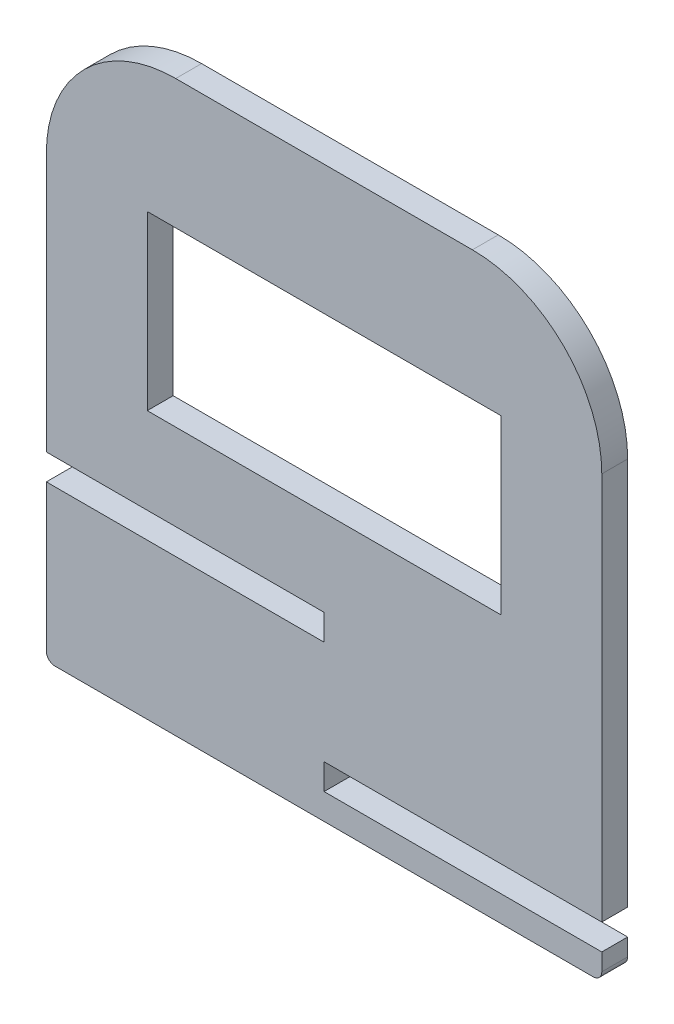
ISO-10303-21;
HEADER;
FILE_DESCRIPTION(('STEP AP214'),'2;1');
FILE_NAME('part.step','',(''),(''),'','','');
FILE_SCHEMA(('AUTOMOTIVE_DESIGN { 1 0 10303 214 1 1 1 1 }'));
ENDSEC;
DATA;
#1=APPLICATION_CONTEXT('core data for automotive mechanical design processes');
#2=APPLICATION_PROTOCOL_DEFINITION('international standard','automotive_design',2000,#1);
#3=PRODUCT_CONTEXT('',#1,'mechanical');
#4=PRODUCT('Part','Part','',(#3));
#5=PRODUCT_RELATED_PRODUCT_CATEGORY('part','',(#4));
#6=PRODUCT_DEFINITION_FORMATION('','',#4);
#7=PRODUCT_DEFINITION_CONTEXT('part definition',#1,'design');
#8=PRODUCT_DEFINITION('design','',#6,#7);
#9=PRODUCT_DEFINITION_SHAPE('','',#8);
#10=(LENGTH_UNIT() NAMED_UNIT(*) SI_UNIT(.MILLI.,.METRE.));
#11=(NAMED_UNIT(*) PLANE_ANGLE_UNIT() SI_UNIT($,.RADIAN.));
#12=(NAMED_UNIT(*) SI_UNIT($,.STERADIAN.) SOLID_ANGLE_UNIT());
#13=UNCERTAINTY_MEASURE_WITH_UNIT(LENGTH_MEASURE(1.E-05),#10,'distance_accuracy_value','');
#14=(GEOMETRIC_REPRESENTATION_CONTEXT(3) GLOBAL_UNCERTAINTY_ASSIGNED_CONTEXT((#13)) GLOBAL_UNIT_ASSIGNED_CONTEXT((#10,
#11,#12)) REPRESENTATION_CONTEXT('',''));
#15=CARTESIAN_POINT('',(0.,0.,0.));
#16=DIRECTION('',(0.,0.,1.));
#17=DIRECTION('',(1.,0.,0.));
#18=AXIS2_PLACEMENT_3D('',#15,#16,#17);
#19=CARTESIAN_POINT('',(-0.261503553829211,-69.4208677655693,3.));
#20=DIRECTION('',(0.,-1.,0.));
#21=DIRECTION('',(0.,0.,-1.));
#22=AXIS2_PLACEMENT_3D('',#19,#20,#21);
#23=PLANE('',#22);
#24=DIRECTION('',(-1.,0.,0.));
#25=VECTOR('',#24,1.);
#26=CARTESIAN_POINT('',(-0.261503553829211,-69.4208677655693,0.));
#27=LINE('',#26,#25);
#28=CARTESIAN_POINT('',(-0.261503553829211,-69.4208677655693,0.));
#29=VERTEX_POINT('',#28);
#30=CARTESIAN_POINT('',(-32.4615035538292,-69.4208677655693,0.));
#31=VERTEX_POINT('',#30);
#32=EDGE_CURVE('E251',#29,#31,#27,.T.);
#33=ORIENTED_EDGE('',*,*,#32,.T.);
#34=DIRECTION('',(0.,0.,-1.));
#35=VECTOR('',#34,1.);
#36=CARTESIAN_POINT('',(-32.4615035538292,-69.4208677655693,3.));
#37=LINE('',#36,#35);
#38=CARTESIAN_POINT('',(-32.4615035538292,-69.4208677655693,3.));
#39=VERTEX_POINT('',#38);
#40=EDGE_CURVE('E12',#39,#31,#37,.T.);
#41=ORIENTED_EDGE('',*,*,#40,.F.);
#42=DIRECTION('',(-1.,0.,0.));
#43=VECTOR('',#42,1.);
#44=CARTESIAN_POINT('',(-0.261503553829211,-69.4208677655693,3.));
#45=LINE('',#44,#43);
#46=CARTESIAN_POINT('',(-0.261503553829211,-69.4208677655693,3.));
#47=VERTEX_POINT('',#46);
#48=EDGE_CURVE('E291',#47,#39,#45,.T.);
#49=ORIENTED_EDGE('',*,*,#48,.F.);
#50=DIRECTION('',(0.,0.,-1.));
#51=VECTOR('',#50,1.);
#52=CARTESIAN_POINT('',(-0.261503553829211,-69.4208677655693,3.));
#53=LINE('',#52,#51);
#54=EDGE_CURVE('E347',#47,#29,#53,.T.);
#55=ORIENTED_EDGE('',*,*,#54,.T.);
#56=EDGE_LOOP('',(#33,#41,#49,#55));
#57=FACE_BOUND('',#56,.T.);
#58=ADVANCED_FACE('F105',(#57),#23,.F.);
#59=CARTESIAN_POINT('',(-32.4615035538292,-66.4208677655693,3.));
#60=DIRECTION('',(1.,0.,0.));
#61=DIRECTION('',(0.,1.,0.));
#62=AXIS2_PLACEMENT_3D('',#59,#60,#61);
#63=PLANE('',#62);
#64=DIRECTION('',(0.,-1.,0.));
#65=VECTOR('',#64,1.);
#66=CARTESIAN_POINT('',(-32.4615035538292,-66.4208677655693,0.));
#67=LINE('',#66,#65);
#68=CARTESIAN_POINT('',(-32.4615035538292,-66.4208677655693,0.));
#69=VERTEX_POINT('',#68);
#70=EDGE_CURVE('E351',#69,#31,#67,.T.);
#71=ORIENTED_EDGE('',*,*,#70,.F.);
#72=DIRECTION('',(0.,0.,-1.));
#73=VECTOR('',#72,1.);
#74=CARTESIAN_POINT('',(-32.4615035538292,-66.4208677655693,3.));
#75=LINE('',#74,#73);
#76=CARTESIAN_POINT('',(-32.4615035538292,-66.4208677655693,3.));
#77=VERTEX_POINT('',#76);
#78=EDGE_CURVE('E113',#77,#69,#75,.T.);
#79=ORIENTED_EDGE('',*,*,#78,.F.);
#80=DIRECTION('',(0.,-1.,0.));
#81=VECTOR('',#80,1.);
#82=CARTESIAN_POINT('',(-32.4615035538292,-66.4208677655693,3.));
#83=LINE('',#82,#81);
#84=EDGE_CURVE('E294',#77,#39,#83,.T.);
#85=ORIENTED_EDGE('',*,*,#84,.T.);
#86=ORIENTED_EDGE('',*,*,#40,.T.);
#87=EDGE_LOOP('',(#71,#79,#85,#86));
#88=FACE_BOUND('',#87,.T.);
#89=ADVANCED_FACE('F458',(#88),#63,.T.);
#90=CARTESIAN_POINT('',(-0.261503553829211,-66.4208677655693,3.));
#91=DIRECTION('',(0.,-1.,0.));
#92=DIRECTION('',(1.,0.,0.));
#93=AXIS2_PLACEMENT_3D('',#90,#91,#92);
#94=PLANE('',#93);
#95=DIRECTION('',(-1.,0.,0.));
#96=VECTOR('',#95,1.);
#97=CARTESIAN_POINT('',(-0.261503553829211,-66.4208677655693,0.));
#98=LINE('',#97,#96);
#99=CARTESIAN_POINT('',(-0.261503553829211,-66.4208677655693,0.));
#100=VERTEX_POINT('',#99);
#101=EDGE_CURVE('E355',#100,#69,#98,.T.);
#102=ORIENTED_EDGE('',*,*,#101,.F.);
#103=DIRECTION('',(0.,0.,-1.));
#104=VECTOR('',#103,1.);
#105=CARTESIAN_POINT('',(-0.261503553829211,-66.4208677655693,3.));
#106=LINE('',#105,#104);
#107=CARTESIAN_POINT('',(-0.261503553829211,-66.4208677655693,3.));
#108=VERTEX_POINT('',#107);
#109=EDGE_CURVE('E448',#108,#100,#106,.T.);
#110=ORIENTED_EDGE('',*,*,#109,.F.);
#111=DIRECTION('',(-1.,0.,0.));
#112=VECTOR('',#111,1.);
#113=CARTESIAN_POINT('',(-0.261503553829211,-66.4208677655693,3.));
#114=LINE('',#113,#112);
#115=EDGE_CURVE('E299',#108,#77,#114,.T.);
#116=ORIENTED_EDGE('',*,*,#115,.T.);
#117=ORIENTED_EDGE('',*,*,#78,.T.);
#118=EDGE_LOOP('',(#102,#110,#116,#117));
#119=FACE_BOUND('',#118,.T.);
#120=ADVANCED_FACE('F454',(#119),#94,.T.);
#121=CARTESIAN_POINT('',(-0.261503553829215,-21.4208677655693,3.));
#122=DIRECTION('',(1.,0.,0.));
#123=DIRECTION('',(0.,1.,0.));
#124=AXIS2_PLACEMENT_3D('',#121,#122,#123);
#125=PLANE('',#124);
#126=DIRECTION('',(0.,-1.,0.));
#127=VECTOR('',#126,1.);
#128=CARTESIAN_POINT('',(-0.261503553829215,-21.4208677655693,0.));
#129=LINE('',#128,#127);
#130=CARTESIAN_POINT('',(-0.261503553829213,-21.4208677655693,0.));
#131=VERTEX_POINT('',#130);
#132=EDGE_CURVE('E359',#131,#100,#129,.T.);
#133=ORIENTED_EDGE('',*,*,#132,.F.);
#134=DIRECTION('',(0.,0.,-1.));
#135=VECTOR('',#134,1.);
#136=CARTESIAN_POINT('',(-0.261503553829213,-21.4208677655693,3.));
#137=LINE('',#136,#135);
#138=CARTESIAN_POINT('',(-0.261503553829213,-21.4208677655693,3.));
#139=VERTEX_POINT('',#138);
#140=EDGE_CURVE('E445',#139,#131,#137,.T.);
#141=ORIENTED_EDGE('',*,*,#140,.F.);
#142=DIRECTION('',(0.,-1.,0.));
#143=VECTOR('',#142,1.);
#144=CARTESIAN_POINT('',(-0.261503553829215,-21.4208677655693,3.));
#145=LINE('',#144,#143);
#146=EDGE_CURVE('E303',#139,#108,#145,.T.);
#147=ORIENTED_EDGE('',*,*,#146,.T.);
#148=ORIENTED_EDGE('',*,*,#109,.T.);
#149=EDGE_LOOP('',(#133,#141,#147,#148));
#150=FACE_BOUND('',#149,.T.);
#151=ADVANCED_FACE('F466',(#150),#125,.T.);
#152=CARTESIAN_POINT('',(-15.2615035538292,-21.4208677655693,3.));
#153=DIRECTION('',(0.,0.,-1.));
#154=DIRECTION('',(-1.,0.,0.));
#155=AXIS2_PLACEMENT_3D('',#152,#153,#154);
#156=CYLINDRICAL_SURFACE('',#155,15.);
#157=CARTESIAN_POINT('',(-15.2615035538292,-21.4208677655693,0.));
#158=DIRECTION('',(0.,0.,-1.));
#159=DIRECTION('',(-1.,0.,0.));
#160=AXIS2_PLACEMENT_3D('',#157,#158,#159);
#161=CIRCLE('',#160,15.);
#162=CARTESIAN_POINT('',(-15.2615035538292,-6.42086776556929,0.));
#163=VERTEX_POINT('',#162);
#164=EDGE_CURVE('E363',#163,#131,#161,.T.);
#165=ORIENTED_EDGE('',*,*,#164,.F.);
#166=DIRECTION('',(0.,0.,-1.));
#167=VECTOR('',#166,1.);
#168=CARTESIAN_POINT('',(-15.2615035538292,-6.42086776556929,3.));
#169=LINE('',#168,#167);
#170=CARTESIAN_POINT('',(-15.2615035538292,-6.42086776556929,3.));
#171=VERTEX_POINT('',#170);
#172=EDGE_CURVE('E442',#171,#163,#169,.T.);
#173=ORIENTED_EDGE('',*,*,#172,.F.);
#174=CARTESIAN_POINT('',(-15.2615035538292,-21.4208677655693,3.));
#175=DIRECTION('',(0.,0.,-1.));
#176=DIRECTION('',(-1.,0.,0.));
#177=AXIS2_PLACEMENT_3D('',#174,#175,#176);
#178=CIRCLE('',#177,15.);
#179=EDGE_CURVE('E307',#171,#139,#178,.T.);
#180=ORIENTED_EDGE('',*,*,#179,.T.);
#181=ORIENTED_EDGE('',*,*,#140,.T.);
#182=EDGE_LOOP('',(#165,#173,#180,#181));
#183=FACE_BOUND('',#182,.T.);
#184=ADVANCED_FACE('F524',(#183),#156,.T.);
#185=CARTESIAN_POINT('',(-49.6615035538292,-6.42086776556929,3.));
#186=DIRECTION('',(0.,1.,0.));
#187=DIRECTION('',(0.,0.,1.));
#188=AXIS2_PLACEMENT_3D('',#185,#186,#187);
#189=PLANE('',#188);
#190=DIRECTION('',(1.,0.,0.));
#191=VECTOR('',#190,1.);
#192=CARTESIAN_POINT('',(-49.6615035538292,-6.42086776556929,0.));
#193=LINE('',#192,#191);
#194=CARTESIAN_POINT('',(-49.6615035538292,-6.42086776556929,0.));
#195=VERTEX_POINT('',#194);
#196=EDGE_CURVE('E367',#195,#163,#193,.T.);
#197=ORIENTED_EDGE('',*,*,#196,.F.);
#198=DIRECTION('',(0.,0.,-1.));
#199=VECTOR('',#198,1.);
#200=CARTESIAN_POINT('',(-49.6615035538292,-6.42086776556929,3.));
#201=LINE('',#200,#199);
#202=CARTESIAN_POINT('',(-49.6615035538292,-6.42086776556929,3.));
#203=VERTEX_POINT('',#202);
#204=EDGE_CURVE('E439',#203,#195,#201,.T.);
#205=ORIENTED_EDGE('',*,*,#204,.F.);
#206=DIRECTION('',(1.,0.,0.));
#207=VECTOR('',#206,1.);
#208=CARTESIAN_POINT('',(-49.6615035538292,-6.42086776556929,3.));
#209=LINE('',#208,#207);
#210=EDGE_CURVE('E311',#203,#171,#209,.T.);
#211=ORIENTED_EDGE('',*,*,#210,.T.);
#212=ORIENTED_EDGE('',*,*,#172,.T.);
#213=EDGE_LOOP('',(#197,#205,#211,#212));
#214=FACE_BOUND('',#213,.T.);
#215=ADVANCED_FACE('F522',(#214),#189,.T.);
#216=CARTESIAN_POINT('',(-49.6615035538292,-21.4208677655693,3.));
#217=DIRECTION('',(0.,0.,-1.));
#218=DIRECTION('',(-1.,0.,0.));
#219=AXIS2_PLACEMENT_3D('',#216,#217,#218);
#220=CYLINDRICAL_SURFACE('',#219,15.);
#221=CARTESIAN_POINT('',(-49.6615035538292,-21.4208677655693,0.));
#222=DIRECTION('',(0.,0.,1.));
#223=DIRECTION('',(1.,0.,0.));
#224=AXIS2_PLACEMENT_3D('',#221,#222,#223);
#225=CIRCLE('',#224,15.);
#226=CARTESIAN_POINT('',(-64.6615035538292,-21.4208677655693,0.));
#227=VERTEX_POINT('',#226);
#228=EDGE_CURVE('E371',#195,#227,#225,.T.);
#229=ORIENTED_EDGE('',*,*,#228,.T.);
#230=DIRECTION('',(0.,0.,-1.));
#231=VECTOR('',#230,1.);
#232=CARTESIAN_POINT('',(-64.6615035538292,-21.4208677655693,3.));
#233=LINE('',#232,#231);
#234=CARTESIAN_POINT('',(-64.6615035538292,-21.4208677655693,3.));
#235=VERTEX_POINT('',#234);
#236=EDGE_CURVE('E435',#235,#227,#233,.T.);
#237=ORIENTED_EDGE('',*,*,#236,.F.);
#238=CARTESIAN_POINT('',(-49.6615035538292,-21.4208677655693,3.));
#239=DIRECTION('',(0.,0.,1.));
#240=DIRECTION('',(1.,0.,0.));
#241=AXIS2_PLACEMENT_3D('',#238,#239,#240);
#242=CIRCLE('',#241,15.);
#243=EDGE_CURVE('E315',#203,#235,#242,.T.);
#244=ORIENTED_EDGE('',*,*,#243,.F.);
#245=ORIENTED_EDGE('',*,*,#204,.T.);
#246=EDGE_LOOP('',(#229,#237,#244,#245));
#247=FACE_BOUND('',#246,.T.);
#248=ADVANCED_FACE('F518',(#247),#220,.T.);
#249=CARTESIAN_POINT('',(-64.6615035538292,-21.4208677655693,3.));
#250=DIRECTION('',(1.,0.,0.));
#251=DIRECTION('',(0.,0.,-1.));
#252=AXIS2_PLACEMENT_3D('',#249,#250,#251);
#253=PLANE('',#252);
#254=DIRECTION('',(0.,-1.,0.));
#255=VECTOR('',#254,1.);
#256=CARTESIAN_POINT('',(-64.6615035538292,-21.4208677655693,0.));
#257=LINE('',#256,#255);
#258=CARTESIAN_POINT('',(-64.6615035538292,-51.4208677655693,0.));
#259=VERTEX_POINT('',#258);
#260=EDGE_CURVE('E374',#227,#259,#257,.T.);
#261=ORIENTED_EDGE('',*,*,#260,.T.);
#262=DIRECTION('',(0.,0.,-1.));
#263=VECTOR('',#262,1.);
#264=CARTESIAN_POINT('',(-64.6615035538292,-51.4208677655693,3.));
#265=LINE('',#264,#263);
#266=CARTESIAN_POINT('',(-64.6615035538292,-51.4208677655693,3.));
#267=VERTEX_POINT('',#266);
#268=EDGE_CURVE('E431',#267,#259,#265,.T.);
#269=ORIENTED_EDGE('',*,*,#268,.F.);
#270=DIRECTION('',(0.,-1.,0.));
#271=VECTOR('',#270,1.);
#272=CARTESIAN_POINT('',(-64.6615035538292,-21.4208677655693,3.));
#273=LINE('',#272,#271);
#274=EDGE_CURVE('E318',#235,#267,#273,.T.);
#275=ORIENTED_EDGE('',*,*,#274,.F.);
#276=ORIENTED_EDGE('',*,*,#236,.T.);
#277=EDGE_LOOP('',(#261,#269,#275,#276));
#278=FACE_BOUND('',#277,.T.);
#279=ADVANCED_FACE('F514',(#278),#253,.F.);
#280=CARTESIAN_POINT('',(-64.6615035538292,-51.4208677655693,3.));
#281=DIRECTION('',(0.,1.,0.));
#282=DIRECTION('',(-1.,0.,0.));
#283=AXIS2_PLACEMENT_3D('',#280,#281,#282);
#284=PLANE('',#283);
#285=DIRECTION('',(1.,0.,0.));
#286=VECTOR('',#285,1.);
#287=CARTESIAN_POINT('',(-64.6615035538292,-51.4208677655693,0.));
#288=LINE('',#287,#286);
#289=CARTESIAN_POINT('',(-32.4615035538292,-51.4208677655693,0.));
#290=VERTEX_POINT('',#289);
#291=EDGE_CURVE('E377',#259,#290,#288,.T.);
#292=ORIENTED_EDGE('',*,*,#291,.T.);
#293=DIRECTION('',(0.,0.,-1.));
#294=VECTOR('',#293,1.);
#295=CARTESIAN_POINT('',(-32.4615035538292,-51.4208677655693,3.));
#296=LINE('',#295,#294);
#297=CARTESIAN_POINT('',(-32.4615035538292,-51.4208677655693,3.));
#298=VERTEX_POINT('',#297);
#299=EDGE_CURVE('E427',#298,#290,#296,.T.);
#300=ORIENTED_EDGE('',*,*,#299,.F.);
#301=DIRECTION('',(1.,0.,0.));
#302=VECTOR('',#301,1.);
#303=CARTESIAN_POINT('',(-64.6615035538292,-51.4208677655693,3.));
#304=LINE('',#303,#302);
#305=EDGE_CURVE('E321',#267,#298,#304,.T.);
#306=ORIENTED_EDGE('',*,*,#305,.F.);
#307=ORIENTED_EDGE('',*,*,#268,.T.);
#308=EDGE_LOOP('',(#292,#300,#306,#307));
#309=FACE_BOUND('',#308,.T.);
#310=ADVANCED_FACE('F509',(#309),#284,.F.);
#311=CARTESIAN_POINT('',(-32.4615035538292,-51.4208677655693,3.));
#312=DIRECTION('',(1.,0.,0.));
#313=DIRECTION('',(0.,0.,-1.));
#314=AXIS2_PLACEMENT_3D('',#311,#312,#313);
#315=PLANE('',#314);
#316=DIRECTION('',(0.,-1.,0.));
#317=VECTOR('',#316,1.);
#318=CARTESIAN_POINT('',(-32.4615035538292,-51.4208677655693,0.));
#319=LINE('',#318,#317);
#320=CARTESIAN_POINT('',(-32.4615035538292,-54.4208677655693,0.));
#321=VERTEX_POINT('',#320);
#322=EDGE_CURVE('E380',#290,#321,#319,.T.);
#323=ORIENTED_EDGE('',*,*,#322,.T.);
#324=DIRECTION('',(0.,0.,-1.));
#325=VECTOR('',#324,1.);
#326=CARTESIAN_POINT('',(-32.4615035538292,-54.4208677655693,3.));
#327=LINE('',#326,#325);
#328=CARTESIAN_POINT('',(-32.4615035538292,-54.4208677655693,3.));
#329=VERTEX_POINT('',#328);
#330=EDGE_CURVE('E424',#329,#321,#327,.T.);
#331=ORIENTED_EDGE('',*,*,#330,.F.);
#332=DIRECTION('',(0.,-1.,0.));
#333=VECTOR('',#332,1.);
#334=CARTESIAN_POINT('',(-32.4615035538292,-51.4208677655693,3.));
#335=LINE('',#334,#333);
#336=EDGE_CURVE('E324',#298,#329,#335,.T.);
#337=ORIENTED_EDGE('',*,*,#336,.F.);
#338=ORIENTED_EDGE('',*,*,#299,.T.);
#339=EDGE_LOOP('',(#323,#331,#337,#338));
#340=FACE_BOUND('',#339,.T.);
#341=ADVANCED_FACE('F503',(#340),#315,.F.);
#342=CARTESIAN_POINT('',(-64.6615035538292,-54.4208677655693,3.));
#343=DIRECTION('',(0.,1.,0.));
#344=DIRECTION('',(0.,0.,1.));
#345=AXIS2_PLACEMENT_3D('',#342,#343,#344);
#346=PLANE('',#345);
#347=DIRECTION('',(1.,0.,0.));
#348=VECTOR('',#347,1.);
#349=CARTESIAN_POINT('',(-64.6615035538292,-54.4208677655693,0.));
#350=LINE('',#349,#348);
#351=CARTESIAN_POINT('',(-64.6615035538292,-54.4208677655693,0.));
#352=VERTEX_POINT('',#351);
#353=EDGE_CURVE('E384',#352,#321,#350,.T.);
#354=ORIENTED_EDGE('',*,*,#353,.F.);
#355=DIRECTION('',(0.,0.,-1.));
#356=VECTOR('',#355,1.);
#357=CARTESIAN_POINT('',(-64.6615035538292,-54.4208677655693,3.));
#358=LINE('',#357,#356);
#359=CARTESIAN_POINT('',(-64.6615035538292,-54.4208677655693,3.));
#360=VERTEX_POINT('',#359);
#361=EDGE_CURVE('E421',#360,#352,#358,.T.);
#362=ORIENTED_EDGE('',*,*,#361,.F.);
#363=DIRECTION('',(1.,0.,0.));
#364=VECTOR('',#363,1.);
#365=CARTESIAN_POINT('',(-64.6615035538292,-54.4208677655693,3.));
#366=LINE('',#365,#364);
#367=EDGE_CURVE('E327',#360,#329,#366,.T.);
#368=ORIENTED_EDGE('',*,*,#367,.T.);
#369=ORIENTED_EDGE('',*,*,#330,.T.);
#370=EDGE_LOOP('',(#354,#362,#368,#369));
#371=FACE_BOUND('',#370,.T.);
#372=ADVANCED_FACE('F499',(#371),#346,.T.);
#373=CARTESIAN_POINT('',(-64.6615035538292,-54.4208677655693,3.));
#374=DIRECTION('',(1.,0.,0.));
#375=DIRECTION('',(0.,1.,0.));
#376=AXIS2_PLACEMENT_3D('',#373,#374,#375);
#377=PLANE('',#376);
#378=DIRECTION('',(0.,-1.,0.));
#379=VECTOR('',#378,1.);
#380=CARTESIAN_POINT('',(-64.6615035538292,-54.4208677655693,0.));
#381=LINE('',#380,#379);
#382=CARTESIAN_POINT('',(-64.6615035538292,-71.4208677655693,0.));
#383=VERTEX_POINT('',#382);
#384=EDGE_CURVE('E388',#352,#383,#381,.T.);
#385=ORIENTED_EDGE('',*,*,#384,.T.);
#386=DIRECTION('',(0.,0.,-1.));
#387=VECTOR('',#386,1.);
#388=CARTESIAN_POINT('',(-64.6615035538292,-71.4208677655693,3.));
#389=LINE('',#388,#387);
#390=CARTESIAN_POINT('',(-64.6615035538292,-71.4208677655693,3.));
#391=VERTEX_POINT('',#390);
#392=EDGE_CURVE('E417',#391,#383,#389,.T.);
#393=ORIENTED_EDGE('',*,*,#392,.F.);
#394=DIRECTION('',(0.,-1.,0.));
#395=VECTOR('',#394,1.);
#396=CARTESIAN_POINT('',(-64.6615035538292,-54.4208677655693,3.));
#397=LINE('',#396,#395);
#398=EDGE_CURVE('E331',#360,#391,#397,.T.);
#399=ORIENTED_EDGE('',*,*,#398,.F.);
#400=ORIENTED_EDGE('',*,*,#361,.T.);
#401=EDGE_LOOP('',(#385,#393,#399,#400));
#402=FACE_BOUND('',#401,.T.);
#403=ADVANCED_FACE('F494',(#402),#377,.F.);
#404=CARTESIAN_POINT('',(-63.6615035538292,-71.4208677655693,3.));
#405=DIRECTION('',(0.,0.,-1.));
#406=DIRECTION('',(-1.,0.,0.));
#407=AXIS2_PLACEMENT_3D('',#404,#405,#406);
#408=CYLINDRICAL_SURFACE('',#407,0.999999999999994);
#409=CARTESIAN_POINT('',(-63.6615035538292,-71.4208677655693,0.));
#410=DIRECTION('',(0.,0.,1.));
#411=DIRECTION('',(1.,0.,0.));
#412=AXIS2_PLACEMENT_3D('',#409,#410,#411);
#413=CIRCLE('',#412,0.999999999999994);
#414=CARTESIAN_POINT('',(-63.6615035538292,-72.4208677655693,0.));
#415=VERTEX_POINT('',#414);
#416=EDGE_CURVE('E391',#383,#415,#413,.T.);
#417=ORIENTED_EDGE('',*,*,#416,.T.);
#418=DIRECTION('',(0.,0.,-1.));
#419=VECTOR('',#418,1.);
#420=CARTESIAN_POINT('',(-63.6615035538292,-72.4208677655693,3.));
#421=LINE('',#420,#419);
#422=CARTESIAN_POINT('',(-63.6615035538292,-72.4208677655693,3.));
#423=VERTEX_POINT('',#422);
#424=EDGE_CURVE('E413',#423,#415,#421,.T.);
#425=ORIENTED_EDGE('',*,*,#424,.F.);
#426=CARTESIAN_POINT('',(-63.6615035538292,-71.4208677655693,3.));
#427=DIRECTION('',(0.,0.,1.));
#428=DIRECTION('',(1.,0.,0.));
#429=AXIS2_PLACEMENT_3D('',#426,#427,#428);
#430=CIRCLE('',#429,0.999999999999994);
#431=EDGE_CURVE('E334',#391,#423,#430,.T.);
#432=ORIENTED_EDGE('',*,*,#431,.F.);
#433=ORIENTED_EDGE('',*,*,#392,.T.);
#434=EDGE_LOOP('',(#417,#425,#432,#433));
#435=FACE_BOUND('',#434,.T.);
#436=ADVANCED_FACE('F490',(#435),#408,.T.);
#437=CARTESIAN_POINT('',(-63.6615035538292,-72.4208677655693,3.));
#438=DIRECTION('',(0.,1.,0.));
#439=DIRECTION('',(0.,0.,1.));
#440=AXIS2_PLACEMENT_3D('',#437,#438,#439);
#441=PLANE('',#440);
#442=DIRECTION('',(1.,0.,0.));
#443=VECTOR('',#442,1.);
#444=CARTESIAN_POINT('',(-63.6615035538292,-72.4208677655693,0.));
#445=LINE('',#444,#443);
#446=CARTESIAN_POINT('',(-1.26150355382922,-72.4208677655693,0.));
#447=VERTEX_POINT('',#446);
#448=EDGE_CURVE('E394',#415,#447,#445,.T.);
#449=ORIENTED_EDGE('',*,*,#448,.T.);
#450=DIRECTION('',(0.,0.,-1.));
#451=VECTOR('',#450,1.);
#452=CARTESIAN_POINT('',(-1.26150355382922,-72.4208677655693,3.));
#453=LINE('',#452,#451);
#454=CARTESIAN_POINT('',(-1.26150355382922,-72.4208677655693,3.));
#455=VERTEX_POINT('',#454);
#456=EDGE_CURVE('E409',#455,#447,#453,.T.);
#457=ORIENTED_EDGE('',*,*,#456,.F.);
#458=DIRECTION('',(1.,0.,0.));
#459=VECTOR('',#458,1.);
#460=CARTESIAN_POINT('',(-63.6615035538292,-72.4208677655693,3.));
#461=LINE('',#460,#459);
#462=EDGE_CURVE('E337',#423,#455,#461,.T.);
#463=ORIENTED_EDGE('',*,*,#462,.F.);
#464=ORIENTED_EDGE('',*,*,#424,.T.);
#465=EDGE_LOOP('',(#449,#457,#463,#464));
#466=FACE_BOUND('',#465,.T.);
#467=ADVANCED_FACE('F485',(#466),#441,.F.);
#468=CARTESIAN_POINT('',(-1.26150355382921,-71.4208677655693,3.));
#469=DIRECTION('',(0.,0.,-1.));
#470=DIRECTION('',(-1.,0.,0.));
#471=AXIS2_PLACEMENT_3D('',#468,#469,#470);
#472=CYLINDRICAL_SURFACE('',#471,0.999999999999992);
#473=CARTESIAN_POINT('',(-1.26150355382921,-71.4208677655693,0.));
#474=DIRECTION('',(0.,0.,1.));
#475=DIRECTION('',(1.,0.,0.));
#476=AXIS2_PLACEMENT_3D('',#473,#474,#475);
#477=CIRCLE('',#476,0.999999999999992);
#478=CARTESIAN_POINT('',(-0.261503553829229,-71.4208677655693,0.));
#479=VERTEX_POINT('',#478);
#480=EDGE_CURVE('E397',#447,#479,#477,.T.);
#481=ORIENTED_EDGE('',*,*,#480,.T.);
#482=DIRECTION('',(0.,0.,-1.));
#483=VECTOR('',#482,1.);
#484=CARTESIAN_POINT('',(-0.261503553829229,-71.4208677655693,3.));
#485=LINE('',#484,#483);
#486=CARTESIAN_POINT('',(-0.261503553829229,-71.4208677655693,3.));
#487=VERTEX_POINT('',#486);
#488=EDGE_CURVE('E406',#487,#479,#485,.T.);
#489=ORIENTED_EDGE('',*,*,#488,.F.);
#490=CARTESIAN_POINT('',(-1.26150355382921,-71.4208677655693,3.));
#491=DIRECTION('',(0.,0.,1.));
#492=DIRECTION('',(1.,0.,0.));
#493=AXIS2_PLACEMENT_3D('',#490,#491,#492);
#494=CIRCLE('',#493,0.999999999999992);
#495=EDGE_CURVE('E340',#455,#487,#494,.T.);
#496=ORIENTED_EDGE('',*,*,#495,.F.);
#497=ORIENTED_EDGE('',*,*,#456,.T.);
#498=EDGE_LOOP('',(#481,#489,#496,#497));
#499=FACE_BOUND('',#498,.T.);
#500=ADVANCED_FACE('F479',(#499),#472,.T.);
#501=CARTESIAN_POINT('',(-0.261503553829211,-69.4208677655693,3.));
#502=DIRECTION('',(1.,0.,0.));
#503=DIRECTION('',(0.,1.,0.));
#504=AXIS2_PLACEMENT_3D('',#501,#502,#503);
#505=PLANE('',#504);
#506=DIRECTION('',(0.,-1.,0.));
#507=VECTOR('',#506,1.);
#508=CARTESIAN_POINT('',(-0.261503553829211,-69.4208677655693,0.));
#509=LINE('',#508,#507);
#510=EDGE_CURVE('E295',#29,#479,#509,.T.);
#511=ORIENTED_EDGE('',*,*,#510,.F.);
#512=ORIENTED_EDGE('',*,*,#54,.F.);
#513=DIRECTION('',(0.,-1.,0.));
#514=VECTOR('',#513,1.);
#515=CARTESIAN_POINT('',(-0.261503553829211,-69.4208677655693,3.));
#516=LINE('',#515,#514);
#517=EDGE_CURVE('E343',#47,#487,#516,.T.);
#518=ORIENTED_EDGE('',*,*,#517,.T.);
#519=ORIENTED_EDGE('',*,*,#488,.T.);
#520=EDGE_LOOP('',(#511,#512,#518,#519));
#521=FACE_BOUND('',#520,.T.);
#522=ADVANCED_FACE('F475',(#521),#505,.T.);
#523=CARTESIAN_POINT('',(-15.2615035538292,-21.4208677655693,3.));
#524=DIRECTION('',(0.,0.,-1.));
#525=DIRECTION('',(-1.,0.,0.));
#526=AXIS2_PLACEMENT_3D('',#523,#524,#525);
#527=PLANE('',#526);
#528=DIRECTION('',(1.,0.,0.));
#529=VECTOR('',#528,1.);
#530=CARTESIAN_POINT('',(0.,-21.4208677655693,3.));
#531=LINE('',#530,#529);
#532=CARTESIAN_POINT('',(-52.9615035538292,-21.4208677655693,3.));
#533=VERTEX_POINT('',#532);
#534=CARTESIAN_POINT('',(-11.9615035538292,-21.4208677655693,3.));
#535=VERTEX_POINT('',#534);
#536=EDGE_CURVE('E246',#533,#535,#531,.T.);
#537=ORIENTED_EDGE('',*,*,#536,.T.);
#538=DIRECTION('',(0.,-1.,0.));
#539=VECTOR('',#538,1.);
#540=CARTESIAN_POINT('',(-11.9615035538292,0.,3.));
#541=LINE('',#540,#539);
#542=CARTESIAN_POINT('',(-11.9615035538292,-41.4208677655693,3.));
#543=VERTEX_POINT('',#542);
#544=EDGE_CURVE('E255',#535,#543,#541,.T.);
#545=ORIENTED_EDGE('',*,*,#544,.T.);
#546=DIRECTION('',(1.,0.,0.));
#547=VECTOR('',#546,1.);
#548=CARTESIAN_POINT('',(0.,-41.4208677655693,3.));
#549=LINE('',#548,#547);
#550=CARTESIAN_POINT('',(-52.9615035538292,-41.4208677655693,3.));
#551=VERTEX_POINT('',#550);
#552=EDGE_CURVE('E269',#551,#543,#549,.T.);
#553=ORIENTED_EDGE('',*,*,#552,.F.);
#554=DIRECTION('',(0.,-1.,0.));
#555=VECTOR('',#554,1.);
#556=CARTESIAN_POINT('',(-52.9615035538292,0.,3.));
#557=LINE('',#556,#555);
#558=EDGE_CURVE('E265',#533,#551,#557,.T.);
#559=ORIENTED_EDGE('',*,*,#558,.F.);
#560=EDGE_LOOP('',(#537,#545,#553,#559));
#561=FACE_BOUND('',#560,.T.);
#562=ORIENTED_EDGE('',*,*,#48,.T.);
#563=ORIENTED_EDGE('',*,*,#84,.F.);
#564=ORIENTED_EDGE('',*,*,#115,.F.);
#565=ORIENTED_EDGE('',*,*,#146,.F.);
#566=ORIENTED_EDGE('',*,*,#179,.F.);
#567=ORIENTED_EDGE('',*,*,#210,.F.);
#568=ORIENTED_EDGE('',*,*,#243,.T.);
#569=ORIENTED_EDGE('',*,*,#274,.T.);
#570=ORIENTED_EDGE('',*,*,#305,.T.);
#571=ORIENTED_EDGE('',*,*,#336,.T.);
#572=ORIENTED_EDGE('',*,*,#367,.F.);
#573=ORIENTED_EDGE('',*,*,#398,.T.);
#574=ORIENTED_EDGE('',*,*,#431,.T.);
#575=ORIENTED_EDGE('',*,*,#462,.T.);
#576=ORIENTED_EDGE('',*,*,#495,.T.);
#577=ORIENTED_EDGE('',*,*,#517,.F.);
#578=EDGE_LOOP('',(#562,#563,#564,#565,#566,#567,#568,#569,#570,#571,#572,#573,#574,#575,#576,#577));
#579=FACE_BOUND('',#578,.T.);
#580=ADVANCED_FACE('F263',(#561,#579),#527,.F.);
#581=CARTESIAN_POINT('',(-15.2615035538292,-21.4208677655693,0.));
#582=DIRECTION('',(0.,0.,-1.));
#583=DIRECTION('',(-1.,0.,0.));
#584=AXIS2_PLACEMENT_3D('',#581,#582,#583);
#585=PLANE('',#584);
#586=DIRECTION('',(0.,-1.,0.));
#587=VECTOR('',#586,1.);
#588=CARTESIAN_POINT('',(-11.9615035538292,0.,0.));
#589=LINE('',#588,#587);
#590=CARTESIAN_POINT('',(-11.9615035538292,-21.4208677655693,0.));
#591=VERTEX_POINT('',#590);
#592=CARTESIAN_POINT('',(-11.9615035538292,-41.4208677655693,0.));
#593=VERTEX_POINT('',#592);
#594=EDGE_CURVE('E128',#591,#593,#589,.T.);
#595=ORIENTED_EDGE('',*,*,#594,.F.);
#596=DIRECTION('',(1.,0.,0.));
#597=VECTOR('',#596,1.);
#598=CARTESIAN_POINT('',(0.,-21.4208677655693,0.));
#599=LINE('',#598,#597);
#600=CARTESIAN_POINT('',(-52.9615035538292,-21.4208677655693,0.));
#601=VERTEX_POINT('',#600);
#602=EDGE_CURVE('E249',#601,#591,#599,.T.);
#603=ORIENTED_EDGE('',*,*,#602,.F.);
#604=DIRECTION('',(0.,-1.,0.));
#605=VECTOR('',#604,1.);
#606=CARTESIAN_POINT('',(-52.9615035538292,0.,0.));
#607=LINE('',#606,#605);
#608=CARTESIAN_POINT('',(-52.9615035538292,-41.4208677655693,0.));
#609=VERTEX_POINT('',#608);
#610=EDGE_CURVE('E278',#601,#609,#607,.T.);
#611=ORIENTED_EDGE('',*,*,#610,.T.);
#612=DIRECTION('',(1.,0.,0.));
#613=VECTOR('',#612,1.);
#614=CARTESIAN_POINT('',(0.,-41.4208677655693,0.));
#615=LINE('',#614,#613);
#616=EDGE_CURVE('E261',#609,#593,#615,.T.);
#617=ORIENTED_EDGE('',*,*,#616,.T.);
#618=EDGE_LOOP('',(#595,#603,#611,#617));
#619=FACE_BOUND('',#618,.T.);
#620=ORIENTED_EDGE('',*,*,#32,.F.);
#621=ORIENTED_EDGE('',*,*,#510,.T.);
#622=ORIENTED_EDGE('',*,*,#480,.F.);
#623=ORIENTED_EDGE('',*,*,#448,.F.);
#624=ORIENTED_EDGE('',*,*,#416,.F.);
#625=ORIENTED_EDGE('',*,*,#384,.F.);
#626=ORIENTED_EDGE('',*,*,#353,.T.);
#627=ORIENTED_EDGE('',*,*,#322,.F.);
#628=ORIENTED_EDGE('',*,*,#291,.F.);
#629=ORIENTED_EDGE('',*,*,#260,.F.);
#630=ORIENTED_EDGE('',*,*,#228,.F.);
#631=ORIENTED_EDGE('',*,*,#196,.T.);
#632=ORIENTED_EDGE('',*,*,#164,.T.);
#633=ORIENTED_EDGE('',*,*,#132,.T.);
#634=ORIENTED_EDGE('',*,*,#101,.T.);
#635=ORIENTED_EDGE('',*,*,#70,.T.);
#636=EDGE_LOOP('',(#620,#621,#622,#623,#624,#625,#626,#627,#628,#629,#630,#631,#632,#633,#634,#635));
#637=FACE_BOUND('',#636,.T.);
#638=ADVANCED_FACE('F462',(#619,#637),#585,.T.);
#639=CARTESIAN_POINT('',(-11.9615035538292,0.,3.));
#640=DIRECTION('',(1.,0.,0.));
#641=DIRECTION('',(0.,1.,0.));
#642=AXIS2_PLACEMENT_3D('',#639,#640,#641);
#643=PLANE('',#642);
#644=ORIENTED_EDGE('',*,*,#594,.T.);
#645=DIRECTION('',(0.,0.,-1.));
#646=VECTOR('',#645,1.);
#647=CARTESIAN_POINT('',(-11.9615035538292,-41.4208677655693,3.));
#648=LINE('',#647,#646);
#649=EDGE_CURVE('E257',#543,#593,#648,.T.);
#650=ORIENTED_EDGE('',*,*,#649,.F.);
#651=ORIENTED_EDGE('',*,*,#544,.F.);
#652=DIRECTION('',(0.,0.,-1.));
#653=VECTOR('',#652,1.);
#654=CARTESIAN_POINT('',(-11.9615035538292,-21.4208677655693,3.));
#655=LINE('',#654,#653);
#656=EDGE_CURVE('E242',#535,#591,#655,.T.);
#657=ORIENTED_EDGE('',*,*,#656,.T.);
#658=EDGE_LOOP('',(#644,#650,#651,#657));
#659=FACE_BOUND('',#658,.T.);
#660=ADVANCED_FACE('F256',(#659),#643,.F.);
#661=CARTESIAN_POINT('',(0.,-21.4208677655693,3.));
#662=DIRECTION('',(0.,1.,0.));
#663=DIRECTION('',(0.,0.,1.));
#664=AXIS2_PLACEMENT_3D('',#661,#662,#663);
#665=PLANE('',#664);
#666=ORIENTED_EDGE('',*,*,#602,.T.);
#667=ORIENTED_EDGE('',*,*,#656,.F.);
#668=ORIENTED_EDGE('',*,*,#536,.F.);
#669=DIRECTION('',(0.,0.,-1.));
#670=VECTOR('',#669,1.);
#671=CARTESIAN_POINT('',(-52.9615035538292,-21.4208677655693,3.));
#672=LINE('',#671,#670);
#673=EDGE_CURVE('E252',#533,#601,#672,.T.);
#674=ORIENTED_EDGE('',*,*,#673,.T.);
#675=EDGE_LOOP('',(#666,#667,#668,#674));
#676=FACE_BOUND('',#675,.T.);
#677=ADVANCED_FACE('F244',(#676),#665,.F.);
#678=CARTESIAN_POINT('',(-52.9615035538292,0.,3.));
#679=DIRECTION('',(1.,0.,0.));
#680=DIRECTION('',(0.,0.,-1.));
#681=AXIS2_PLACEMENT_3D('',#678,#679,#680);
#682=PLANE('',#681);
#683=ORIENTED_EDGE('',*,*,#610,.F.);
#684=ORIENTED_EDGE('',*,*,#673,.F.);
#685=ORIENTED_EDGE('',*,*,#558,.T.);
#686=DIRECTION('',(0.,0.,-1.));
#687=VECTOR('',#686,1.);
#688=CARTESIAN_POINT('',(-52.9615035538292,-41.4208677655693,3.));
#689=LINE('',#688,#687);
#690=EDGE_CURVE('E120',#551,#609,#689,.T.);
#691=ORIENTED_EDGE('',*,*,#690,.T.);
#692=EDGE_LOOP('',(#683,#684,#685,#691));
#693=FACE_BOUND('',#692,.T.);
#694=ADVANCED_FACE('F673',(#693),#682,.T.);
#695=CARTESIAN_POINT('',(0.,-41.4208677655693,3.));
#696=DIRECTION('',(0.,1.,0.));
#697=DIRECTION('',(0.,0.,1.));
#698=AXIS2_PLACEMENT_3D('',#695,#696,#697);
#699=PLANE('',#698);
#700=ORIENTED_EDGE('',*,*,#616,.F.);
#701=ORIENTED_EDGE('',*,*,#690,.F.);
#702=ORIENTED_EDGE('',*,*,#552,.T.);
#703=ORIENTED_EDGE('',*,*,#649,.T.);
#704=EDGE_LOOP('',(#700,#701,#702,#703));
#705=FACE_BOUND('',#704,.T.);
#706=ADVANCED_FACE('F682',(#705),#699,.T.);
#707=CLOSED_SHELL('',(#58,#89,#120,#151,#184,#215,#248,#279,#310,#341,#372,#403,#436,#467,#500,
#522,#580,#638,#660,#677,#694,#706));
#708=MANIFOLD_SOLID_BREP('B2',#707);
#709=ADVANCED_BREP_SHAPE_REPRESENTATION('',(#18,#708),#14);
#710=SHAPE_DEFINITION_REPRESENTATION(#9,#709);
ENDSEC;
END-ISO-10303-21;
